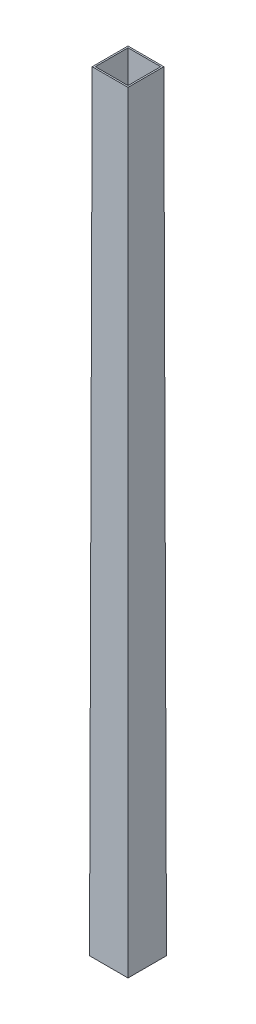
ISO-10303-21;
HEADER;
FILE_DESCRIPTION(('STEP AP214'),'2;1');
FILE_NAME('part.step','',(''),(''),'','','');
FILE_SCHEMA(('AUTOMOTIVE_DESIGN { 1 0 10303 214 1 1 1 1 }'));
ENDSEC;
DATA;
#1=APPLICATION_CONTEXT('core data for automotive mechanical design processes');
#2=APPLICATION_PROTOCOL_DEFINITION('international standard','automotive_design',2000,#1);
#3=PRODUCT_CONTEXT('',#1,'mechanical');
#4=PRODUCT('Part','Part','',(#3));
#5=PRODUCT_RELATED_PRODUCT_CATEGORY('part','',(#4));
#6=PRODUCT_DEFINITION_FORMATION('','',#4);
#7=PRODUCT_DEFINITION_CONTEXT('part definition',#1,'design');
#8=PRODUCT_DEFINITION('design','',#6,#7);
#9=PRODUCT_DEFINITION_SHAPE('','',#8);
#10=(LENGTH_UNIT() NAMED_UNIT(*) SI_UNIT(.MILLI.,.METRE.));
#11=(NAMED_UNIT(*) PLANE_ANGLE_UNIT() SI_UNIT($,.RADIAN.));
#12=(NAMED_UNIT(*) SI_UNIT($,.STERADIAN.) SOLID_ANGLE_UNIT());
#13=UNCERTAINTY_MEASURE_WITH_UNIT(LENGTH_MEASURE(1.E-05),#10,'distance_accuracy_value','');
#14=(GEOMETRIC_REPRESENTATION_CONTEXT(3) GLOBAL_UNCERTAINTY_ASSIGNED_CONTEXT((#13)) GLOBAL_UNIT_ASSIGNED_CONTEXT((#10,
#11,#12)) REPRESENTATION_CONTEXT('',''));
#15=CARTESIAN_POINT('',(0.,0.,0.));
#16=DIRECTION('',(0.,0.,1.));
#17=DIRECTION('',(1.,0.,0.));
#18=AXIS2_PLACEMENT_3D('',#15,#16,#17);
#19=CARTESIAN_POINT('',(0.,0.,0.));
#20=DIRECTION('',(0.,1.,0.));
#21=DIRECTION('',(0.,0.,1.));
#22=AXIS2_PLACEMENT_3D('',#19,#20,#21);
#23=PLANE('',#22);
#24=DIRECTION('',(1.,0.,0.));
#25=VECTOR('',#24,1.);
#26=CARTESIAN_POINT('',(0.,0.,2.29999969538221));
#27=LINE('',#26,#25);
#28=CARTESIAN_POINT('',(-2.29999969538219,0.,2.29999969538221));
#29=VERTEX_POINT('',#28);
#30=CARTESIAN_POINT('',(2.2999996953822,0.,2.29999969538221));
#31=VERTEX_POINT('',#30);
#32=EDGE_CURVE('E146',#29,#31,#27,.T.);
#33=ORIENTED_EDGE('',*,*,#32,.T.);
#34=DIRECTION('',(0.,0.,-1.));
#35=VECTOR('',#34,1.);
#36=CARTESIAN_POINT('',(2.2999996953822,0.,0.));
#37=LINE('',#36,#35);
#38=CARTESIAN_POINT('',(2.2999996953822,0.,-2.29999969538218));
#39=VERTEX_POINT('',#38);
#40=EDGE_CURVE('E137',#31,#39,#37,.T.);
#41=ORIENTED_EDGE('',*,*,#40,.T.);
#42=DIRECTION('',(-1.,0.,0.));
#43=VECTOR('',#42,1.);
#44=CARTESIAN_POINT('',(0.,0.,-2.29999969538218));
#45=LINE('',#44,#43);
#46=CARTESIAN_POINT('',(-2.29999969538219,0.,-2.29999969538218));
#47=VERTEX_POINT('',#46);
#48=EDGE_CURVE('E122',#39,#47,#45,.T.);
#49=ORIENTED_EDGE('',*,*,#48,.T.);
#50=DIRECTION('',(0.,0.,1.));
#51=VECTOR('',#50,1.);
#52=CARTESIAN_POINT('',(-2.29999969538219,0.,0.));
#53=LINE('',#52,#51);
#54=EDGE_CURVE('E72',#47,#29,#53,.T.);
#55=ORIENTED_EDGE('',*,*,#54,.T.);
#56=EDGE_LOOP('',(#33,#41,#49,#55));
#57=FACE_BOUND('',#56,.T.);
#58=DIRECTION('',(0.,0.,-1.));
#59=VECTOR('',#58,1.);
#60=CARTESIAN_POINT('',(2.50000000000001,0.,-2.49999999999998));
#61=LINE('',#60,#59);
#62=CARTESIAN_POINT('',(2.50000000000001,0.,2.50000000000002));
#63=VERTEX_POINT('',#62);
#64=CARTESIAN_POINT('',(2.50000000000001,0.,-2.49999999999998));
#65=VERTEX_POINT('',#64);
#66=EDGE_CURVE('E210',#63,#65,#61,.T.);
#67=ORIENTED_EDGE('',*,*,#66,.F.);
#68=DIRECTION('',(1.,0.,0.));
#69=VECTOR('',#68,1.);
#70=CARTESIAN_POINT('',(-2.5,0.,2.50000000000002));
#71=LINE('',#70,#69);
#72=CARTESIAN_POINT('',(-2.5,0.,2.50000000000002));
#73=VERTEX_POINT('',#72);
#74=EDGE_CURVE('E224',#73,#63,#71,.T.);
#75=ORIENTED_EDGE('',*,*,#74,.F.);
#76=DIRECTION('',(0.,0.,1.));
#77=VECTOR('',#76,1.);
#78=CARTESIAN_POINT('',(-2.5,0.,-2.49999999999998));
#79=LINE('',#78,#77);
#80=CARTESIAN_POINT('',(-2.5,0.,-2.49999999999998));
#81=VERTEX_POINT('',#80);
#82=EDGE_CURVE('E64',#81,#73,#79,.T.);
#83=ORIENTED_EDGE('',*,*,#82,.F.);
#84=DIRECTION('',(-1.,0.,0.));
#85=VECTOR('',#84,1.);
#86=CARTESIAN_POINT('',(-2.5,0.,-2.49999999999998));
#87=LINE('',#86,#85);
#88=EDGE_CURVE('E12',#65,#81,#87,.T.);
#89=ORIENTED_EDGE('',*,*,#88,.F.);
#90=EDGE_LOOP('',(#67,#75,#83,#89));
#91=FACE_BOUND('',#90,.T.);
#92=ADVANCED_FACE('F53',(#57,#91),#23,.F.);
#93=CARTESIAN_POINT('',(0.,100.,0.));
#94=DIRECTION('',(0.,1.,0.));
#95=DIRECTION('',(0.,0.,1.));
#96=AXIS2_PLACEMENT_3D('',#93,#94,#95);
#97=PLANE('',#96);
#98=DIRECTION('',(0.,0.,-1.));
#99=VECTOR('',#98,1.);
#100=CARTESIAN_POINT('',(2.12546659296329,100.,0.));
#101=LINE('',#100,#99);
#102=CARTESIAN_POINT('',(2.12546659296329,100.,2.12546659296333));
#103=VERTEX_POINT('',#102);
#104=CARTESIAN_POINT('',(2.12546659296329,100.,-2.12546659296329));
#105=VERTEX_POINT('',#104);
#106=EDGE_CURVE('E140',#103,#105,#101,.T.);
#107=ORIENTED_EDGE('',*,*,#106,.F.);
#108=DIRECTION('',(1.,0.,0.));
#109=VECTOR('',#108,1.);
#110=CARTESIAN_POINT('',(0.,100.,2.12546659296333));
#111=LINE('',#110,#109);
#112=CARTESIAN_POINT('',(-2.1254665929633,100.,2.12546659296333));
#113=VERTEX_POINT('',#112);
#114=EDGE_CURVE('E159',#113,#103,#111,.T.);
#115=ORIENTED_EDGE('',*,*,#114,.F.);
#116=DIRECTION('',(0.,0.,1.));
#117=VECTOR('',#116,1.);
#118=CARTESIAN_POINT('',(-2.12546659296329,100.,0.));
#119=LINE('',#118,#117);
#120=CARTESIAN_POINT('',(-2.1254665929633,100.,-2.12546659296329));
#121=VERTEX_POINT('',#120);
#122=EDGE_CURVE('E155',#121,#113,#119,.T.);
#123=ORIENTED_EDGE('',*,*,#122,.F.);
#124=DIRECTION('',(-1.,0.,0.));
#125=VECTOR('',#124,1.);
#126=CARTESIAN_POINT('',(0.,100.,-2.12546659296329));
#127=LINE('',#126,#125);
#128=EDGE_CURVE('E158',#105,#121,#127,.T.);
#129=ORIENTED_EDGE('',*,*,#128,.F.);
#130=EDGE_LOOP('',(#107,#115,#123,#129));
#131=FACE_BOUND('',#130,.T.);
#132=DIRECTION('',(0.,0.,-1.));
#133=VECTOR('',#132,1.);
#134=CARTESIAN_POINT('',(2.32546689758107,100.,-2.32546689758109));
#135=LINE('',#134,#133);
#136=CARTESIAN_POINT('',(2.3254668975811,100.,2.32546689758113));
#137=VERTEX_POINT('',#136);
#138=CARTESIAN_POINT('',(2.32546689758107,100.,-2.32546689758109));
#139=VERTEX_POINT('',#138);
#140=EDGE_CURVE('E131',#137,#139,#135,.T.);
#141=ORIENTED_EDGE('',*,*,#140,.T.);
#142=DIRECTION('',(-1.,0.,0.));
#143=VECTOR('',#142,1.);
#144=CARTESIAN_POINT('',(-2.3254668975811,100.,-2.32546689758111));
#145=LINE('',#144,#143);
#146=CARTESIAN_POINT('',(-2.3254668975811,100.,-2.32546689758111));
#147=VERTEX_POINT('',#146);
#148=EDGE_CURVE('E171',#139,#147,#145,.T.);
#149=ORIENTED_EDGE('',*,*,#148,.T.);
#150=DIRECTION('',(0.,0.,1.));
#151=VECTOR('',#150,1.);
#152=CARTESIAN_POINT('',(-2.3254668975811,100.,-2.32546689758111));
#153=LINE('',#152,#151);
#154=CARTESIAN_POINT('',(-2.32546689758112,100.,2.32546689758114));
#155=VERTEX_POINT('',#154);
#156=EDGE_CURVE('E265',#147,#155,#153,.T.);
#157=ORIENTED_EDGE('',*,*,#156,.T.);
#158=DIRECTION('',(1.,0.,0.));
#159=VECTOR('',#158,1.);
#160=CARTESIAN_POINT('',(-2.32546689758112,100.,2.32546689758114));
#161=LINE('',#160,#159);
#162=EDGE_CURVE('E282',#155,#137,#161,.T.);
#163=ORIENTED_EDGE('',*,*,#162,.T.);
#164=EDGE_LOOP('',(#141,#149,#157,#163));
#165=FACE_BOUND('',#164,.T.);
#166=ADVANCED_FACE('F251',(#131,#165),#97,.T.);
#167=CARTESIAN_POINT('',(-2.49999238457224,0.00436331426903009,0.));
#168=DIRECTION('',(-0.999998476913288,0.00174532836589848,0.));
#169=DIRECTION('',(-0.00174532836589848,-0.999998476913288,0.));
#170=AXIS2_PLACEMENT_3D('',#167,#168,#169);
#171=PLANE('',#170);
#172=DIRECTION('',(-0.00174532570762014,-0.999996953833535,-0.00174532570761996));
#173=VECTOR('',#172,1.);
#174=CARTESIAN_POINT('',(-2.3254668975811,100.,-2.32546689758111));
#175=LINE('',#174,#173);
#176=EDGE_CURVE('E271',#147,#81,#175,.T.);
#177=ORIENTED_EDGE('',*,*,#176,.T.);
#178=ORIENTED_EDGE('',*,*,#82,.T.);
#179=DIRECTION('',(-0.00174532570761996,-0.999996953833535,0.00174532570762));
#180=VECTOR('',#179,1.);
#181=CARTESIAN_POINT('',(-2.32546689758112,100.,2.32546689758114));
#182=LINE('',#181,#180);
#183=EDGE_CURVE('E268',#155,#73,#182,.T.);
#184=ORIENTED_EDGE('',*,*,#183,.F.);
#185=ORIENTED_EDGE('',*,*,#156,.F.);
#186=EDGE_LOOP('',(#177,#178,#184,#185));
#187=FACE_BOUND('',#186,.T.);
#188=ADVANCED_FACE('F242',(#187),#171,.T.);
#189=CARTESIAN_POINT('',(0.,0.00436331426902978,2.49999238457226));
#190=DIRECTION('',(0.,0.00174532836589834,0.999998476913288));
#191=DIRECTION('',(0.,-0.999998476913288,0.00174532836589834));
#192=AXIS2_PLACEMENT_3D('',#189,#190,#191);
#193=PLANE('',#192);
#194=ORIENTED_EDGE('',*,*,#183,.T.);
#195=ORIENTED_EDGE('',*,*,#74,.T.);
#196=DIRECTION('',(0.00174532570762024,-0.999996953833535,0.00174532570762007));
#197=VECTOR('',#196,1.);
#198=CARTESIAN_POINT('',(2.3254668975811,100.,2.32546689758113));
#199=LINE('',#198,#197);
#200=EDGE_CURVE('E285',#137,#63,#199,.T.);
#201=ORIENTED_EDGE('',*,*,#200,.F.);
#202=ORIENTED_EDGE('',*,*,#162,.F.);
#203=EDGE_LOOP('',(#194,#195,#201,#202));
#204=FACE_BOUND('',#203,.T.);
#205=ADVANCED_FACE('F189',(#204),#193,.T.);
#206=CARTESIAN_POINT('',(0.,0.0043633142690299,-2.49999238457222));
#207=DIRECTION('',(0.,0.00174532836589841,-0.999998476913288));
#208=DIRECTION('',(0.,0.999998476913288,0.00174532836589841));
#209=AXIS2_PLACEMENT_3D('',#206,#207,#208);
#210=PLANE('',#209);
#211=DIRECTION('',(0.00174532570762052,-0.999996953833535,-0.00174532570762007));
#212=VECTOR('',#211,1.);
#213=CARTESIAN_POINT('',(2.32546689758107,100.,-2.32546689758109));
#214=LINE('',#213,#212);
#215=EDGE_CURVE('E177',#139,#65,#214,.T.);
#216=ORIENTED_EDGE('',*,*,#215,.T.);
#217=ORIENTED_EDGE('',*,*,#88,.T.);
#218=ORIENTED_EDGE('',*,*,#176,.F.);
#219=ORIENTED_EDGE('',*,*,#148,.F.);
#220=EDGE_LOOP('',(#216,#217,#218,#219));
#221=FACE_BOUND('',#220,.T.);
#222=ADVANCED_FACE('F179',(#221),#210,.T.);
#223=CARTESIAN_POINT('',(2.49999238457224,0.00436331426903037,0.));
#224=DIRECTION('',(0.999998476913288,0.00174532836589859,0.));
#225=DIRECTION('',(-0.00174532836589859,0.999998476913288,0.));
#226=AXIS2_PLACEMENT_3D('',#223,#224,#225);
#227=PLANE('',#226);
#228=ORIENTED_EDGE('',*,*,#200,.T.);
#229=ORIENTED_EDGE('',*,*,#66,.T.);
#230=ORIENTED_EDGE('',*,*,#215,.F.);
#231=ORIENTED_EDGE('',*,*,#140,.F.);
#232=EDGE_LOOP('',(#228,#229,#230,#231));
#233=FACE_BOUND('',#232,.T.);
#234=ADVANCED_FACE('F188',(#233),#227,.T.);
#235=CARTESIAN_POINT('',(-2.29999268918958,0.0040142485958504,0.));
#236=DIRECTION('',(-0.999998476913288,0.00174532836589848,0.));
#237=DIRECTION('',(-0.00174532836589848,-0.999998476913288,0.));
#238=AXIS2_PLACEMENT_3D('',#235,#236,#237);
#239=PLANE('',#238);
#240=DIRECTION('',(-0.00174532570762014,-0.999996953833535,-0.00174532570762007));
#241=VECTOR('',#240,1.);
#242=CARTESIAN_POINT('',(-2.29998568303965,0.00802847273559895,-2.29998568303964));
#243=LINE('',#242,#241);
#244=EDGE_CURVE('E127',#121,#47,#243,.T.);
#245=ORIENTED_EDGE('',*,*,#244,.F.);
#246=ORIENTED_EDGE('',*,*,#122,.T.);
#247=DIRECTION('',(-0.00174532570762014,-0.999996953833535,0.00174532570762));
#248=VECTOR('',#247,1.);
#249=CARTESIAN_POINT('',(-2.29998568303965,0.00802847273559885,2.29998568303967));
#250=LINE('',#249,#248);
#251=EDGE_CURVE('E79',#113,#29,#250,.T.);
#252=ORIENTED_EDGE('',*,*,#251,.T.);
#253=ORIENTED_EDGE('',*,*,#54,.F.);
#254=EDGE_LOOP('',(#245,#246,#252,#253));
#255=FACE_BOUND('',#254,.T.);
#256=ADVANCED_FACE('F375',(#255),#239,.F.);
#257=CARTESIAN_POINT('',(0.,0.00401424859585012,2.2999926891896));
#258=DIRECTION('',(0.,0.00174532836589834,0.999998476913288));
#259=DIRECTION('',(0.,-0.999998476913288,0.00174532836589834));
#260=AXIS2_PLACEMENT_3D('',#257,#258,#259);
#261=PLANE('',#260);
#262=ORIENTED_EDGE('',*,*,#251,.F.);
#263=ORIENTED_EDGE('',*,*,#114,.T.);
#264=DIRECTION('',(0.00174532570762024,-0.999996953833535,0.00174532570762));
#265=VECTOR('',#264,1.);
#266=CARTESIAN_POINT('',(2.29998568303966,0.0080284727355991,2.29998568303967));
#267=LINE('',#266,#265);
#268=EDGE_CURVE('E143',#103,#31,#267,.T.);
#269=ORIENTED_EDGE('',*,*,#268,.T.);
#270=ORIENTED_EDGE('',*,*,#32,.F.);
#271=EDGE_LOOP('',(#262,#263,#269,#270));
#272=FACE_BOUND('',#271,.T.);
#273=ADVANCED_FACE('F379',(#272),#261,.F.);
#274=CARTESIAN_POINT('',(0.,0.00401424859585022,-2.29999268918957));
#275=DIRECTION('',(0.,0.00174532836589841,-0.999998476913288));
#276=DIRECTION('',(0.,0.999998476913288,0.00174532836589841));
#277=AXIS2_PLACEMENT_3D('',#274,#275,#276);
#278=PLANE('',#277);
#279=DIRECTION('',(0.00174532570762024,-0.999996953833535,-0.00174532570762007));
#280=VECTOR('',#279,1.);
#281=CARTESIAN_POINT('',(2.29998568303966,0.0080284727355992,-2.29998568303964));
#282=LINE('',#281,#280);
#283=EDGE_CURVE('E125',#105,#39,#282,.T.);
#284=ORIENTED_EDGE('',*,*,#283,.F.);
#285=ORIENTED_EDGE('',*,*,#128,.T.);
#286=ORIENTED_EDGE('',*,*,#244,.T.);
#287=ORIENTED_EDGE('',*,*,#48,.F.);
#288=EDGE_LOOP('',(#284,#285,#286,#287));
#289=FACE_BOUND('',#288,.T.);
#290=ADVANCED_FACE('F124',(#289),#278,.F.);
#291=CARTESIAN_POINT('',(2.29999268918959,0.00401424859585065,0.));
#292=DIRECTION('',(0.999998476913288,0.00174532836589859,0.));
#293=DIRECTION('',(-0.00174532836589859,0.999998476913288,0.));
#294=AXIS2_PLACEMENT_3D('',#291,#292,#293);
#295=PLANE('',#294);
#296=ORIENTED_EDGE('',*,*,#268,.F.);
#297=ORIENTED_EDGE('',*,*,#106,.T.);
#298=ORIENTED_EDGE('',*,*,#283,.T.);
#299=ORIENTED_EDGE('',*,*,#40,.F.);
#300=EDGE_LOOP('',(#296,#297,#298,#299));
#301=FACE_BOUND('',#300,.T.);
#302=ADVANCED_FACE('F136',(#301),#295,.F.);
#303=CLOSED_SHELL('',(#92,#166,#188,#205,#222,#234,#256,#273,#290,#302));
#304=MANIFOLD_SOLID_BREP('B2',#303);
#305=ADVANCED_BREP_SHAPE_REPRESENTATION('',(#18,#304),#14);
#306=SHAPE_DEFINITION_REPRESENTATION(#9,#305);
ENDSEC;
END-ISO-10303-21;
